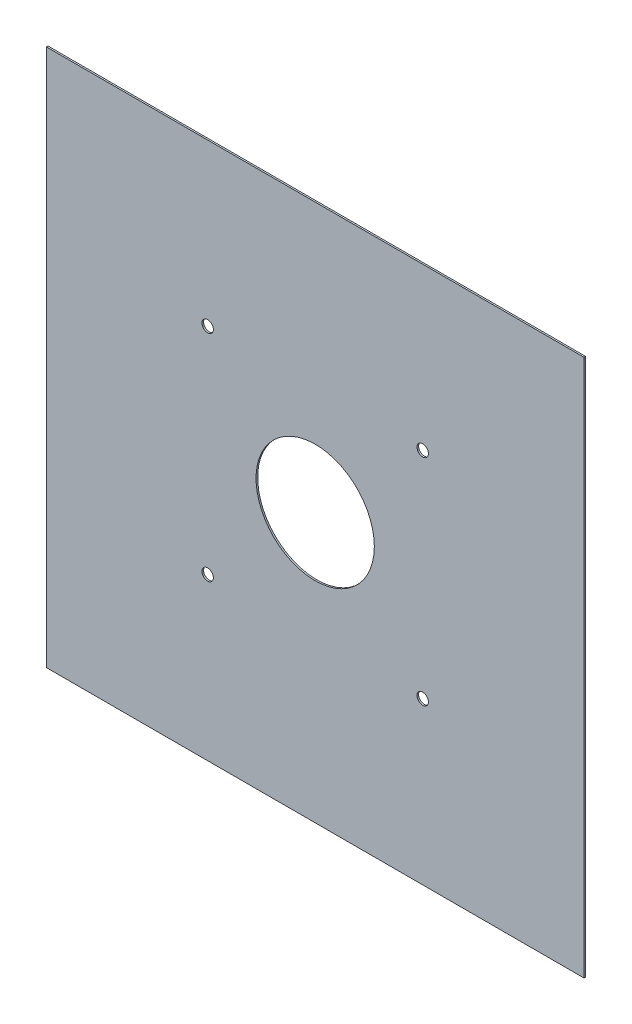
ISO-10303-21;
HEADER;
FILE_DESCRIPTION(('STEP AP214'),'2;1');
FILE_NAME('part.step','',(''),(''),'','','');
FILE_SCHEMA(('AUTOMOTIVE_DESIGN { 1 0 10303 214 1 1 1 1 }'));
ENDSEC;
DATA;
#1=APPLICATION_CONTEXT('core data for automotive mechanical design processes');
#2=APPLICATION_PROTOCOL_DEFINITION('international standard','automotive_design',2000,#1);
#3=PRODUCT_CONTEXT('',#1,'mechanical');
#4=PRODUCT('Part','Part','',(#3));
#5=PRODUCT_RELATED_PRODUCT_CATEGORY('part','',(#4));
#6=PRODUCT_DEFINITION_FORMATION('','',#4);
#7=PRODUCT_DEFINITION_CONTEXT('part definition',#1,'design');
#8=PRODUCT_DEFINITION('design','',#6,#7);
#9=PRODUCT_DEFINITION_SHAPE('','',#8);
#10=(LENGTH_UNIT() NAMED_UNIT(*) SI_UNIT(.MILLI.,.METRE.));
#11=(NAMED_UNIT(*) PLANE_ANGLE_UNIT() SI_UNIT($,.RADIAN.));
#12=(NAMED_UNIT(*) SI_UNIT($,.STERADIAN.) SOLID_ANGLE_UNIT());
#13=UNCERTAINTY_MEASURE_WITH_UNIT(LENGTH_MEASURE(1.E-05),#10,'distance_accuracy_value','');
#14=(GEOMETRIC_REPRESENTATION_CONTEXT(3) GLOBAL_UNCERTAINTY_ASSIGNED_CONTEXT((#13)) GLOBAL_UNIT_ASSIGNED_CONTEXT((#10,
#11,#12)) REPRESENTATION_CONTEXT('',''));
#15=CARTESIAN_POINT('',(0.,0.,0.));
#16=DIRECTION('',(0.,0.,1.));
#17=DIRECTION('',(1.,0.,0.));
#18=AXIS2_PLACEMENT_3D('',#15,#16,#17);
#19=CARTESIAN_POINT('',(12.6999999999999,374.6,1.2));
#20=DIRECTION('',(-1.,0.,0.));
#21=DIRECTION('',(0.,-1.,0.));
#22=AXIS2_PLACEMENT_3D('',#19,#20,#21);
#23=PLANE('',#22);
#24=DIRECTION('',(0.,1.,0.));
#25=VECTOR('',#24,1.);
#26=CARTESIAN_POINT('',(12.6999999999999,374.6,0.));
#27=LINE('',#26,#25);
#28=CARTESIAN_POINT('',(12.6999999999999,-25.4000000000001,0.));
#29=VERTEX_POINT('',#28);
#30=CARTESIAN_POINT('',(12.6999999999999,374.6,0.));
#31=VERTEX_POINT('',#30);
#32=EDGE_CURVE('E100',#29,#31,#27,.T.);
#33=ORIENTED_EDGE('',*,*,#32,.T.);
#34=DIRECTION('',(0.,0.,-1.));
#35=VECTOR('',#34,1.);
#36=CARTESIAN_POINT('',(12.6999999999999,374.6,1.2));
#37=LINE('',#36,#35);
#38=CARTESIAN_POINT('',(12.6999999999999,374.6,1.2));
#39=VERTEX_POINT('',#38);
#40=EDGE_CURVE('E11',#39,#31,#37,.T.);
#41=ORIENTED_EDGE('',*,*,#40,.F.);
#42=DIRECTION('',(0.,1.,0.));
#43=VECTOR('',#42,1.);
#44=CARTESIAN_POINT('',(12.6999999999999,374.6,1.2));
#45=LINE('',#44,#43);
#46=CARTESIAN_POINT('',(12.6999999999999,-25.4000000000001,1.2));
#47=VERTEX_POINT('',#46);
#48=EDGE_CURVE('E88',#47,#39,#45,.T.);
#49=ORIENTED_EDGE('',*,*,#48,.F.);
#50=DIRECTION('',(0.,0.,-1.));
#51=VECTOR('',#50,1.);
#52=CARTESIAN_POINT('',(12.6999999999999,-25.4000000000001,1.2));
#53=LINE('',#52,#51);
#54=EDGE_CURVE('E96',#47,#29,#53,.T.);
#55=ORIENTED_EDGE('',*,*,#54,.T.);
#56=EDGE_LOOP('',(#33,#41,#49,#55));
#57=FACE_BOUND('',#56,.T.);
#58=ADVANCED_FACE('F37',(#57),#23,.F.);
#59=CARTESIAN_POINT('',(12.6999999999999,374.6,1.2));
#60=DIRECTION('',(0.,-1.,0.));
#61=DIRECTION('',(1.,0.,0.));
#62=AXIS2_PLACEMENT_3D('',#59,#60,#61);
#63=PLANE('',#62);
#64=DIRECTION('',(-1.,0.,0.));
#65=VECTOR('',#64,1.);
#66=CARTESIAN_POINT('',(12.6999999999999,374.6,0.));
#67=LINE('',#66,#65);
#68=CARTESIAN_POINT('',(-387.3,374.6,0.));
#69=VERTEX_POINT('',#68);
#70=EDGE_CURVE('E92',#31,#69,#67,.T.);
#71=ORIENTED_EDGE('',*,*,#70,.T.);
#72=DIRECTION('',(0.,0.,-1.));
#73=VECTOR('',#72,1.);
#74=CARTESIAN_POINT('',(-387.3,374.6,1.2));
#75=LINE('',#74,#73);
#76=CARTESIAN_POINT('',(-387.3,374.6,1.2));
#77=VERTEX_POINT('',#76);
#78=EDGE_CURVE('E45',#77,#69,#75,.T.);
#79=ORIENTED_EDGE('',*,*,#78,.F.);
#80=DIRECTION('',(-1.,0.,0.));
#81=VECTOR('',#80,1.);
#82=CARTESIAN_POINT('',(12.6999999999999,374.6,1.2));
#83=LINE('',#82,#81);
#84=EDGE_CURVE('E83',#39,#77,#83,.T.);
#85=ORIENTED_EDGE('',*,*,#84,.F.);
#86=ORIENTED_EDGE('',*,*,#40,.T.);
#87=EDGE_LOOP('',(#71,#79,#85,#86));
#88=FACE_BOUND('',#87,.T.);
#89=ADVANCED_FACE('F91',(#88),#63,.F.);
#90=CARTESIAN_POINT('',(-387.3,374.6,1.2));
#91=DIRECTION('',(1.,0.,0.));
#92=DIRECTION('',(0.,1.,0.));
#93=AXIS2_PLACEMENT_3D('',#90,#91,#92);
#94=PLANE('',#93);
#95=DIRECTION('',(0.,-1.,0.));
#96=VECTOR('',#95,1.);
#97=CARTESIAN_POINT('',(-387.3,374.6,0.));
#98=LINE('',#97,#96);
#99=CARTESIAN_POINT('',(-387.3,-25.4000000000002,0.));
#100=VERTEX_POINT('',#99);
#101=EDGE_CURVE('E70',#69,#100,#98,.T.);
#102=ORIENTED_EDGE('',*,*,#101,.T.);
#103=DIRECTION('',(0.,0.,-1.));
#104=VECTOR('',#103,1.);
#105=CARTESIAN_POINT('',(-387.3,-25.4000000000002,1.2));
#106=LINE('',#105,#104);
#107=CARTESIAN_POINT('',(-387.3,-25.4000000000002,1.2));
#108=VERTEX_POINT('',#107);
#109=EDGE_CURVE('E93',#108,#100,#106,.T.);
#110=ORIENTED_EDGE('',*,*,#109,.F.);
#111=DIRECTION('',(0.,-1.,0.));
#112=VECTOR('',#111,1.);
#113=CARTESIAN_POINT('',(-387.3,374.6,1.2));
#114=LINE('',#113,#112);
#115=EDGE_CURVE('E86',#77,#108,#114,.T.);
#116=ORIENTED_EDGE('',*,*,#115,.F.);
#117=ORIENTED_EDGE('',*,*,#78,.T.);
#118=EDGE_LOOP('',(#102,#110,#116,#117));
#119=FACE_BOUND('',#118,.T.);
#120=ADVANCED_FACE('F94',(#119),#94,.F.);
#121=CARTESIAN_POINT('',(12.6999999999999,-25.4000000000001,1.2));
#122=DIRECTION('',(0.,1.,0.));
#123=DIRECTION('',(-1.,0.,0.));
#124=AXIS2_PLACEMENT_3D('',#121,#122,#123);
#125=PLANE('',#124);
#126=DIRECTION('',(1.,0.,0.));
#127=VECTOR('',#126,1.);
#128=CARTESIAN_POINT('',(12.6999999999999,-25.4000000000001,0.));
#129=LINE('',#128,#127);
#130=EDGE_CURVE('E76',#100,#29,#129,.T.);
#131=ORIENTED_EDGE('',*,*,#130,.T.);
#132=ORIENTED_EDGE('',*,*,#54,.F.);
#133=DIRECTION('',(1.,0.,0.));
#134=VECTOR('',#133,1.);
#135=CARTESIAN_POINT('',(12.6999999999999,-25.4000000000001,1.2));
#136=LINE('',#135,#134);
#137=EDGE_CURVE('E53',#108,#47,#136,.T.);
#138=ORIENTED_EDGE('',*,*,#137,.F.);
#139=ORIENTED_EDGE('',*,*,#109,.T.);
#140=EDGE_LOOP('',(#131,#132,#138,#139));
#141=FACE_BOUND('',#140,.T.);
#142=ADVANCED_FACE('F108',(#141),#125,.F.);
#143=CARTESIAN_POINT('',(0.,0.,1.2));
#144=DIRECTION('',(0.,0.,-1.));
#145=DIRECTION('',(-1.,0.,0.));
#146=AXIS2_PLACEMENT_3D('',#143,#144,#145);
#147=PLANE('',#146);
#148=CARTESIAN_POINT('',(-107.3,254.6,1.2));
#149=DIRECTION('',(0.,0.,1.));
#150=DIRECTION('',(1.,0.,0.));
#151=AXIS2_PLACEMENT_3D('',#148,#149,#150);
#152=CIRCLE('',#151,4.25000000000001);
#153=CARTESIAN_POINT('',(-103.05,254.6,1.2));
#154=VERTEX_POINT('',#153);
#155=EDGE_CURVE('E123',#154,#154,#152,.T.);
#156=ORIENTED_EDGE('',*,*,#155,.F.);
#157=EDGE_LOOP('',(#156));
#158=FACE_BOUND('',#157,.T.);
#159=CARTESIAN_POINT('',(-107.3,94.5999999999999,1.2));
#160=DIRECTION('',(0.,0.,1.));
#161=DIRECTION('',(1.,0.,0.));
#162=AXIS2_PLACEMENT_3D('',#159,#160,#161);
#163=CIRCLE('',#162,4.25000000000001);
#164=CARTESIAN_POINT('',(-103.05,94.5999999999999,1.2));
#165=VERTEX_POINT('',#164);
#166=EDGE_CURVE('E129',#165,#165,#163,.T.);
#167=ORIENTED_EDGE('',*,*,#166,.F.);
#168=EDGE_LOOP('',(#167));
#169=FACE_BOUND('',#168,.T.);
#170=CARTESIAN_POINT('',(-267.3,94.5999999999999,1.2));
#171=DIRECTION('',(0.,0.,1.));
#172=DIRECTION('',(1.,0.,0.));
#173=AXIS2_PLACEMENT_3D('',#170,#171,#172);
#174=CIRCLE('',#173,4.24999999999995);
#175=CARTESIAN_POINT('',(-263.05,94.5999999999999,1.2));
#176=VERTEX_POINT('',#175);
#177=EDGE_CURVE('E135',#176,#176,#174,.T.);
#178=ORIENTED_EDGE('',*,*,#177,.F.);
#179=EDGE_LOOP('',(#178));
#180=FACE_BOUND('',#179,.T.);
#181=CARTESIAN_POINT('',(-267.3,254.6,1.2));
#182=DIRECTION('',(0.,0.,1.));
#183=DIRECTION('',(1.,0.,0.));
#184=AXIS2_PLACEMENT_3D('',#181,#182,#183);
#185=CIRCLE('',#184,4.24999999999995);
#186=CARTESIAN_POINT('',(-263.05,254.6,1.2));
#187=VERTEX_POINT('',#186);
#188=EDGE_CURVE('E117',#187,#187,#185,.T.);
#189=ORIENTED_EDGE('',*,*,#188,.F.);
#190=EDGE_LOOP('',(#189));
#191=FACE_BOUND('',#190,.T.);
#192=CARTESIAN_POINT('',(-187.3,174.6,1.2));
#193=DIRECTION('',(0.,0.,1.));
#194=DIRECTION('',(1.,0.,0.));
#195=AXIS2_PLACEMENT_3D('',#192,#193,#194);
#196=CIRCLE('',#195,44.);
#197=CARTESIAN_POINT('',(-143.3,174.6,1.2));
#198=VERTEX_POINT('',#197);
#199=EDGE_CURVE('E114',#198,#198,#196,.T.);
#200=ORIENTED_EDGE('',*,*,#199,.F.);
#201=EDGE_LOOP('',(#200));
#202=FACE_BOUND('',#201,.T.);
#203=ORIENTED_EDGE('',*,*,#48,.T.);
#204=ORIENTED_EDGE('',*,*,#84,.T.);
#205=ORIENTED_EDGE('',*,*,#115,.T.);
#206=ORIENTED_EDGE('',*,*,#137,.T.);
#207=EDGE_LOOP('',(#203,#204,#205,#206));
#208=FACE_BOUND('',#207,.T.);
#209=ADVANCED_FACE('F84',(#158,#169,#180,#191,#202,#208),#147,.F.);
#210=CARTESIAN_POINT('',(0.,0.,0.));
#211=DIRECTION('',(0.,0.,-1.));
#212=DIRECTION('',(-1.,0.,0.));
#213=AXIS2_PLACEMENT_3D('',#210,#211,#212);
#214=PLANE('',#213);
#215=CARTESIAN_POINT('',(-107.3,254.6,0.));
#216=DIRECTION('',(0.,0.,1.));
#217=DIRECTION('',(1.,0.,0.));
#218=AXIS2_PLACEMENT_3D('',#215,#216,#217);
#219=CIRCLE('',#218,4.25000000000001);
#220=CARTESIAN_POINT('',(-103.05,254.6,0.));
#221=VERTEX_POINT('',#220);
#222=EDGE_CURVE('E120',#221,#221,#219,.T.);
#223=ORIENTED_EDGE('',*,*,#222,.T.);
#224=EDGE_LOOP('',(#223));
#225=FACE_BOUND('',#224,.T.);
#226=CARTESIAN_POINT('',(-107.3,94.5999999999999,0.));
#227=DIRECTION('',(0.,0.,1.));
#228=DIRECTION('',(1.,0.,0.));
#229=AXIS2_PLACEMENT_3D('',#226,#227,#228);
#230=CIRCLE('',#229,4.25000000000001);
#231=CARTESIAN_POINT('',(-103.05,94.5999999999999,0.));
#232=VERTEX_POINT('',#231);
#233=EDGE_CURVE('E126',#232,#232,#230,.T.);
#234=ORIENTED_EDGE('',*,*,#233,.T.);
#235=EDGE_LOOP('',(#234));
#236=FACE_BOUND('',#235,.T.);
#237=CARTESIAN_POINT('',(-267.3,94.5999999999999,0.));
#238=DIRECTION('',(0.,0.,1.));
#239=DIRECTION('',(1.,0.,0.));
#240=AXIS2_PLACEMENT_3D('',#237,#238,#239);
#241=CIRCLE('',#240,4.24999999999995);
#242=CARTESIAN_POINT('',(-263.05,94.5999999999999,0.));
#243=VERTEX_POINT('',#242);
#244=EDGE_CURVE('E132',#243,#243,#241,.T.);
#245=ORIENTED_EDGE('',*,*,#244,.T.);
#246=EDGE_LOOP('',(#245));
#247=FACE_BOUND('',#246,.T.);
#248=CARTESIAN_POINT('',(-267.3,254.6,0.));
#249=DIRECTION('',(0.,0.,1.));
#250=DIRECTION('',(1.,0.,0.));
#251=AXIS2_PLACEMENT_3D('',#248,#249,#250);
#252=CIRCLE('',#251,4.24999999999995);
#253=CARTESIAN_POINT('',(-263.05,254.6,0.));
#254=VERTEX_POINT('',#253);
#255=EDGE_CURVE('E138',#254,#254,#252,.T.);
#256=ORIENTED_EDGE('',*,*,#255,.T.);
#257=EDGE_LOOP('',(#256));
#258=FACE_BOUND('',#257,.T.);
#259=CARTESIAN_POINT('',(-187.3,174.6,0.));
#260=DIRECTION('',(0.,0.,1.));
#261=DIRECTION('',(1.,0.,0.));
#262=AXIS2_PLACEMENT_3D('',#259,#260,#261);
#263=CIRCLE('',#262,44.);
#264=CARTESIAN_POINT('',(-143.3,174.6,0.));
#265=VERTEX_POINT('',#264);
#266=EDGE_CURVE('E103',#265,#265,#263,.T.);
#267=ORIENTED_EDGE('',*,*,#266,.T.);
#268=EDGE_LOOP('',(#267));
#269=FACE_BOUND('',#268,.T.);
#270=ORIENTED_EDGE('',*,*,#32,.F.);
#271=ORIENTED_EDGE('',*,*,#130,.F.);
#272=ORIENTED_EDGE('',*,*,#101,.F.);
#273=ORIENTED_EDGE('',*,*,#70,.F.);
#274=EDGE_LOOP('',(#270,#271,#272,#273));
#275=FACE_BOUND('',#274,.T.);
#276=ADVANCED_FACE('F111',(#225,#236,#247,#258,#269,#275),#214,.T.);
#277=CARTESIAN_POINT('',(-187.3,174.6,0.));
#278=DIRECTION('',(0.,0.,1.));
#279=DIRECTION('',(1.,0.,0.));
#280=AXIS2_PLACEMENT_3D('',#277,#278,#279);
#281=CYLINDRICAL_SURFACE('',#280,44.);
#282=ORIENTED_EDGE('',*,*,#266,.F.);
#283=EDGE_LOOP('',(#282));
#284=FACE_BOUND('',#283,.T.);
#285=ORIENTED_EDGE('',*,*,#199,.T.);
#286=EDGE_LOOP('',(#285));
#287=FACE_BOUND('',#286,.T.);
#288=ADVANCED_FACE('F152',(#284,#287),#281,.F.);
#289=CARTESIAN_POINT('',(-267.3,254.6,0.));
#290=DIRECTION('',(0.,0.,1.));
#291=DIRECTION('',(1.,0.,0.));
#292=AXIS2_PLACEMENT_3D('',#289,#290,#291);
#293=CYLINDRICAL_SURFACE('',#292,4.24999999999995);
#294=ORIENTED_EDGE('',*,*,#255,.F.);
#295=EDGE_LOOP('',(#294));
#296=FACE_BOUND('',#295,.T.);
#297=ORIENTED_EDGE('',*,*,#188,.T.);
#298=EDGE_LOOP('',(#297));
#299=FACE_BOUND('',#298,.T.);
#300=ADVANCED_FACE('F144',(#296,#299),#293,.F.);
#301=CARTESIAN_POINT('',(-267.3,94.5999999999999,0.));
#302=DIRECTION('',(0.,0.,1.));
#303=DIRECTION('',(1.,0.,0.));
#304=AXIS2_PLACEMENT_3D('',#301,#302,#303);
#305=CYLINDRICAL_SURFACE('',#304,4.24999999999995);
#306=ORIENTED_EDGE('',*,*,#244,.F.);
#307=EDGE_LOOP('',(#306));
#308=FACE_BOUND('',#307,.T.);
#309=ORIENTED_EDGE('',*,*,#177,.T.);
#310=EDGE_LOOP('',(#309));
#311=FACE_BOUND('',#310,.T.);
#312=ADVANCED_FACE('F160',(#308,#311),#305,.F.);
#313=CARTESIAN_POINT('',(-107.3,94.5999999999999,0.));
#314=DIRECTION('',(0.,0.,1.));
#315=DIRECTION('',(1.,0.,0.));
#316=AXIS2_PLACEMENT_3D('',#313,#314,#315);
#317=CYLINDRICAL_SURFACE('',#316,4.25000000000001);
#318=ORIENTED_EDGE('',*,*,#233,.F.);
#319=EDGE_LOOP('',(#318));
#320=FACE_BOUND('',#319,.T.);
#321=ORIENTED_EDGE('',*,*,#166,.T.);
#322=EDGE_LOOP('',(#321));
#323=FACE_BOUND('',#322,.T.);
#324=ADVANCED_FACE('F214',(#320,#323),#317,.F.);
#325=CARTESIAN_POINT('',(-107.3,254.6,0.));
#326=DIRECTION('',(0.,0.,1.));
#327=DIRECTION('',(1.,0.,0.));
#328=AXIS2_PLACEMENT_3D('',#325,#326,#327);
#329=CYLINDRICAL_SURFACE('',#328,4.25000000000001);
#330=ORIENTED_EDGE('',*,*,#222,.F.);
#331=EDGE_LOOP('',(#330));
#332=FACE_BOUND('',#331,.T.);
#333=ORIENTED_EDGE('',*,*,#155,.T.);
#334=EDGE_LOOP('',(#333));
#335=FACE_BOUND('',#334,.T.);
#336=ADVANCED_FACE('F225',(#332,#335),#329,.F.);
#337=CLOSED_SHELL('',(#58,#89,#120,#142,#209,#276,#288,#300,#312,#324,#336));
#338=MANIFOLD_SOLID_BREP('B2',#337);
#339=ADVANCED_BREP_SHAPE_REPRESENTATION('',(#18,#338),#14);
#340=SHAPE_DEFINITION_REPRESENTATION(#9,#339);
ENDSEC;
END-ISO-10303-21;
